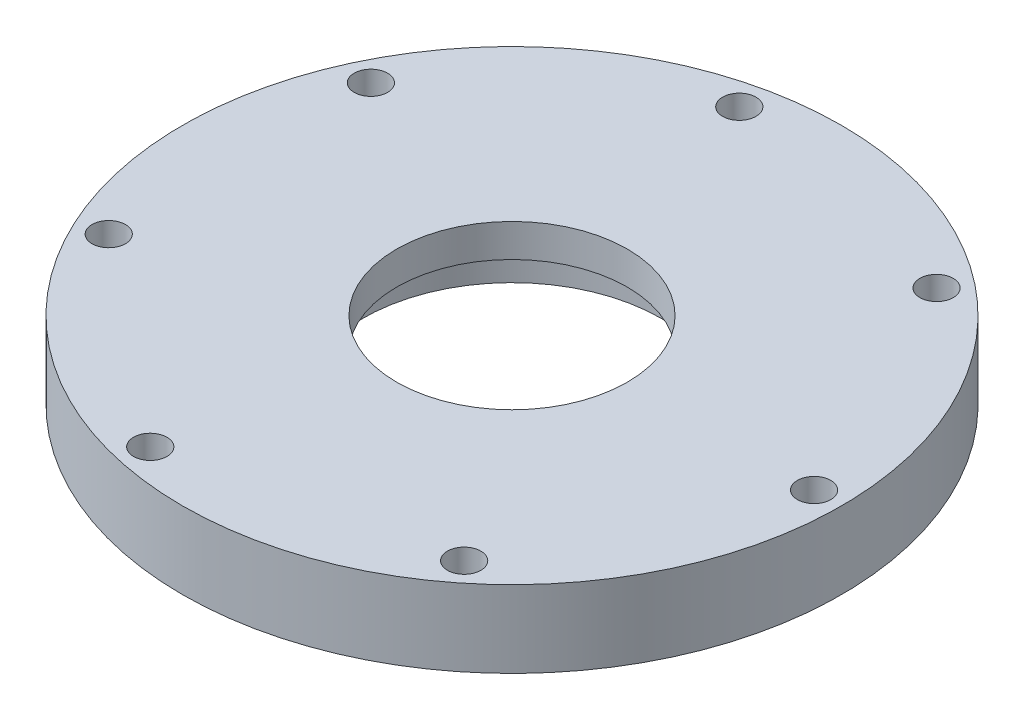
ISO-10303-21;
HEADER;
FILE_DESCRIPTION(('STEP AP214'),'2;1');
FILE_NAME('part.step','',(''),(''),'','','');
FILE_SCHEMA(('AUTOMOTIVE_DESIGN { 1 0 10303 214 1 1 1 1 }'));
ENDSEC;
DATA;
#1=APPLICATION_CONTEXT('core data for automotive mechanical design processes');
#2=APPLICATION_PROTOCOL_DEFINITION('international standard','automotive_design',2000,#1);
#3=PRODUCT_CONTEXT('',#1,'mechanical');
#4=PRODUCT('Part','Part','',(#3));
#5=PRODUCT_RELATED_PRODUCT_CATEGORY('part','',(#4));
#6=PRODUCT_DEFINITION_FORMATION('','',#4);
#7=PRODUCT_DEFINITION_CONTEXT('part definition',#1,'design');
#8=PRODUCT_DEFINITION('design','',#6,#7);
#9=PRODUCT_DEFINITION_SHAPE('','',#8);
#10=(LENGTH_UNIT() NAMED_UNIT(*) SI_UNIT(.MILLI.,.METRE.));
#11=(NAMED_UNIT(*) PLANE_ANGLE_UNIT() SI_UNIT($,.RADIAN.));
#12=(NAMED_UNIT(*) SI_UNIT($,.STERADIAN.) SOLID_ANGLE_UNIT());
#13=UNCERTAINTY_MEASURE_WITH_UNIT(LENGTH_MEASURE(1.E-05),#10,'distance_accuracy_value','');
#14=(GEOMETRIC_REPRESENTATION_CONTEXT(3) GLOBAL_UNCERTAINTY_ASSIGNED_CONTEXT((#13)) GLOBAL_UNIT_ASSIGNED_CONTEXT((#10,
#11,#12)) REPRESENTATION_CONTEXT('',''));
#15=CARTESIAN_POINT('',(0.,0.,0.));
#16=DIRECTION('',(0.,0.,1.));
#17=DIRECTION('',(1.,0.,0.));
#18=AXIS2_PLACEMENT_3D('',#15,#16,#17);
#19=CARTESIAN_POINT('',(0.,7.,0.));
#20=DIRECTION('',(0.,-1.,0.));
#21=DIRECTION('',(0.,0.,-1.));
#22=AXIS2_PLACEMENT_3D('',#19,#20,#21);
#23=CYLINDRICAL_SURFACE('',#22,10.5);
#24=CARTESIAN_POINT('',(0.,7.,0.));
#25=DIRECTION('',(0.,1.,0.));
#26=DIRECTION('',(0.,0.,1.));
#27=AXIS2_PLACEMENT_3D('',#24,#25,#26);
#28=CIRCLE('',#27,10.5);
#29=CARTESIAN_POINT('',(0.,7.,10.5));
#30=VERTEX_POINT('',#29);
#31=EDGE_CURVE('E44',#30,#30,#28,.T.);
#32=ORIENTED_EDGE('',*,*,#31,.T.);
#33=EDGE_LOOP('',(#32));
#34=FACE_BOUND('',#33,.T.);
#35=CARTESIAN_POINT('',(0.,4.,0.));
#36=DIRECTION('',(0.,-1.,0.));
#37=DIRECTION('',(0.,0.,-1.));
#38=AXIS2_PLACEMENT_3D('',#35,#36,#37);
#39=CIRCLE('',#38,10.5);
#40=CARTESIAN_POINT('',(0.,4.,-10.5));
#41=VERTEX_POINT('',#40);
#42=EDGE_CURVE('E35',#41,#41,#39,.T.);
#43=ORIENTED_EDGE('',*,*,#42,.T.);
#44=EDGE_LOOP('',(#43));
#45=FACE_BOUND('',#44,.T.);
#46=ADVANCED_FACE('F31',(#34,#45),#23,.F.);
#47=CARTESIAN_POINT('',(0.,7.,0.));
#48=DIRECTION('',(0.,1.,0.));
#49=DIRECTION('',(0.,0.,1.));
#50=AXIS2_PLACEMENT_3D('',#47,#48,#49);
#51=PLANE('',#50);
#52=CARTESIAN_POINT('',(27.5,7.,0.));
#53=DIRECTION('',(0.,1.,0.));
#54=DIRECTION('',(0.,0.,1.));
#55=AXIS2_PLACEMENT_3D('',#52,#53,#54);
#56=CIRCLE('',#55,1.52);
#57=CARTESIAN_POINT('',(27.5,7.,1.52));
#58=VERTEX_POINT('',#57);
#59=EDGE_CURVE('E91',#58,#58,#56,.T.);
#60=ORIENTED_EDGE('',*,*,#59,.F.);
#61=EDGE_LOOP('',(#60));
#62=FACE_BOUND('',#61,.T.);
#63=CARTESIAN_POINT('',(17.1459695511151,7.,21.5003657678709));
#64=DIRECTION('',(0.,1.,0.));
#65=DIRECTION('',(0.,0.,1.));
#66=AXIS2_PLACEMENT_3D('',#63,#64,#65);
#67=CIRCLE('',#66,1.52);
#68=CARTESIAN_POINT('',(17.1459695511151,7.,23.0203657678709));
#69=VERTEX_POINT('',#68);
#70=EDGE_CURVE('E85',#69,#69,#67,.T.);
#71=ORIENTED_EDGE('',*,*,#70,.F.);
#72=EDGE_LOOP('',(#71));
#73=FACE_BOUND('',#72,.T.);
#74=CARTESIAN_POINT('',(-6.11932568379875,7.,26.8105175850001));
#75=DIRECTION('',(0.,1.,0.));
#76=DIRECTION('',(0.,0.,1.));
#77=AXIS2_PLACEMENT_3D('',#74,#75,#76);
#78=CIRCLE('',#77,1.52);
#79=CARTESIAN_POINT('',(-6.11932568379875,7.,28.3305175850001));
#80=VERTEX_POINT('',#79);
#81=EDGE_CURVE('E79',#80,#80,#78,.T.);
#82=ORIENTED_EDGE('',*,*,#81,.F.);
#83=EDGE_LOOP('',(#82));
#84=FACE_BOUND('',#83,.T.);
#85=CARTESIAN_POINT('',(-24.7766438673166,7.,11.9318028257327));
#86=DIRECTION('',(0.,1.,0.));
#87=DIRECTION('',(0.,0.,1.));
#88=AXIS2_PLACEMENT_3D('',#85,#86,#87);
#89=CIRCLE('',#88,1.52);
#90=CARTESIAN_POINT('',(-24.7766438673166,7.,13.4518028257327));
#91=VERTEX_POINT('',#90);
#92=EDGE_CURVE('E73',#91,#91,#89,.T.);
#93=ORIENTED_EDGE('',*,*,#92,.F.);
#94=EDGE_LOOP('',(#93));
#95=FACE_BOUND('',#94,.T.);
#96=CARTESIAN_POINT('',(-24.7766438673164,7.,-11.931802825733));
#97=DIRECTION('',(0.,1.,0.));
#98=DIRECTION('',(0.,0.,1.));
#99=AXIS2_PLACEMENT_3D('',#96,#97,#98);
#100=CIRCLE('',#99,1.52);
#101=CARTESIAN_POINT('',(-24.7766438673164,7.,-10.411802825733));
#102=VERTEX_POINT('',#101);
#103=EDGE_CURVE('E67',#102,#102,#100,.T.);
#104=ORIENTED_EDGE('',*,*,#103,.F.);
#105=EDGE_LOOP('',(#104));
#106=FACE_BOUND('',#105,.T.);
#107=CARTESIAN_POINT('',(-6.11932568379838,7.,-26.8105175850002));
#108=DIRECTION('',(0.,1.,0.));
#109=DIRECTION('',(0.,0.,1.));
#110=AXIS2_PLACEMENT_3D('',#107,#108,#109);
#111=CIRCLE('',#110,1.52);
#112=CARTESIAN_POINT('',(-6.11932568379838,7.,-25.2905175850002));
#113=VERTEX_POINT('',#112);
#114=EDGE_CURVE('E61',#113,#113,#111,.T.);
#115=ORIENTED_EDGE('',*,*,#114,.F.);
#116=EDGE_LOOP('',(#115));
#117=FACE_BOUND('',#116,.T.);
#118=CARTESIAN_POINT('',(17.1459695511154,7.,-21.5003657678706));
#119=DIRECTION('',(0.,1.,0.));
#120=DIRECTION('',(0.,0.,1.));
#121=AXIS2_PLACEMENT_3D('',#118,#119,#120);
#122=CIRCLE('',#121,1.52);
#123=CARTESIAN_POINT('',(17.1459695511154,7.,-19.9803657678706));
#124=VERTEX_POINT('',#123);
#125=EDGE_CURVE('E55',#124,#124,#122,.T.);
#126=ORIENTED_EDGE('',*,*,#125,.F.);
#127=EDGE_LOOP('',(#126));
#128=FACE_BOUND('',#127,.T.);
#129=CARTESIAN_POINT('',(0.,7.,0.));
#130=DIRECTION('',(0.,1.,0.));
#131=DIRECTION('',(0.,0.,1.));
#132=AXIS2_PLACEMENT_3D('',#129,#130,#131);
#133=CIRCLE('',#132,30.);
#134=CARTESIAN_POINT('',(0.,7.,30.));
#135=VERTEX_POINT('',#134);
#136=EDGE_CURVE('E10',#135,#135,#133,.T.);
#137=ORIENTED_EDGE('',*,*,#136,.T.);
#138=EDGE_LOOP('',(#137));
#139=FACE_BOUND('',#138,.T.);
#140=ORIENTED_EDGE('',*,*,#31,.F.);
#141=EDGE_LOOP('',(#140));
#142=FACE_BOUND('',#141,.T.);
#143=ADVANCED_FACE('F107',(#62,#73,#84,#95,#106,#117,#128,#139,#142),#51,.T.);
#144=CARTESIAN_POINT('',(0.,0.,0.));
#145=DIRECTION('',(0.,1.,0.));
#146=DIRECTION('',(0.,0.,1.));
#147=AXIS2_PLACEMENT_3D('',#144,#145,#146);
#148=PLANE('',#147);
#149=CARTESIAN_POINT('',(27.5,0.,0.));
#150=DIRECTION('',(0.,1.,0.));
#151=DIRECTION('',(0.,0.,1.));
#152=AXIS2_PLACEMENT_3D('',#149,#150,#151);
#153=CIRCLE('',#152,1.52);
#154=CARTESIAN_POINT('',(27.5,0.,1.52));
#155=VERTEX_POINT('',#154);
#156=EDGE_CURVE('E52',#155,#155,#153,.T.);
#157=ORIENTED_EDGE('',*,*,#156,.T.);
#158=EDGE_LOOP('',(#157));
#159=FACE_BOUND('',#158,.T.);
#160=CARTESIAN_POINT('',(17.1459695511151,0.,21.5003657678709));
#161=DIRECTION('',(0.,1.,0.));
#162=DIRECTION('',(0.,0.,1.));
#163=AXIS2_PLACEMENT_3D('',#160,#161,#162);
#164=CIRCLE('',#163,1.52);
#165=CARTESIAN_POINT('',(17.1459695511151,0.,23.0203657678709));
#166=VERTEX_POINT('',#165);
#167=EDGE_CURVE('E88',#166,#166,#164,.T.);
#168=ORIENTED_EDGE('',*,*,#167,.T.);
#169=EDGE_LOOP('',(#168));
#170=FACE_BOUND('',#169,.T.);
#171=CARTESIAN_POINT('',(-6.11932568379875,0.,26.8105175850001));
#172=DIRECTION('',(0.,1.,0.));
#173=DIRECTION('',(0.,0.,1.));
#174=AXIS2_PLACEMENT_3D('',#171,#172,#173);
#175=CIRCLE('',#174,1.52);
#176=CARTESIAN_POINT('',(-6.11932568379875,0.,28.3305175850001));
#177=VERTEX_POINT('',#176);
#178=EDGE_CURVE('E82',#177,#177,#175,.T.);
#179=ORIENTED_EDGE('',*,*,#178,.T.);
#180=EDGE_LOOP('',(#179));
#181=FACE_BOUND('',#180,.T.);
#182=CARTESIAN_POINT('',(-24.7766438673166,0.,11.9318028257327));
#183=DIRECTION('',(0.,1.,0.));
#184=DIRECTION('',(0.,0.,1.));
#185=AXIS2_PLACEMENT_3D('',#182,#183,#184);
#186=CIRCLE('',#185,1.52);
#187=CARTESIAN_POINT('',(-24.7766438673166,0.,13.4518028257327));
#188=VERTEX_POINT('',#187);
#189=EDGE_CURVE('E76',#188,#188,#186,.T.);
#190=ORIENTED_EDGE('',*,*,#189,.T.);
#191=EDGE_LOOP('',(#190));
#192=FACE_BOUND('',#191,.T.);
#193=CARTESIAN_POINT('',(-24.7766438673164,0.,-11.931802825733));
#194=DIRECTION('',(0.,1.,0.));
#195=DIRECTION('',(0.,0.,1.));
#196=AXIS2_PLACEMENT_3D('',#193,#194,#195);
#197=CIRCLE('',#196,1.52);
#198=CARTESIAN_POINT('',(-24.7766438673164,0.,-10.411802825733));
#199=VERTEX_POINT('',#198);
#200=EDGE_CURVE('E70',#199,#199,#197,.T.);
#201=ORIENTED_EDGE('',*,*,#200,.T.);
#202=EDGE_LOOP('',(#201));
#203=FACE_BOUND('',#202,.T.);
#204=CARTESIAN_POINT('',(-6.11932568379838,0.,-26.8105175850002));
#205=DIRECTION('',(0.,1.,0.));
#206=DIRECTION('',(0.,0.,1.));
#207=AXIS2_PLACEMENT_3D('',#204,#205,#206);
#208=CIRCLE('',#207,1.52);
#209=CARTESIAN_POINT('',(-6.11932568379838,0.,-25.2905175850002));
#210=VERTEX_POINT('',#209);
#211=EDGE_CURVE('E64',#210,#210,#208,.T.);
#212=ORIENTED_EDGE('',*,*,#211,.T.);
#213=EDGE_LOOP('',(#212));
#214=FACE_BOUND('',#213,.T.);
#215=CARTESIAN_POINT('',(17.1459695511154,0.,-21.5003657678706));
#216=DIRECTION('',(0.,1.,0.));
#217=DIRECTION('',(0.,0.,1.));
#218=AXIS2_PLACEMENT_3D('',#215,#216,#217);
#219=CIRCLE('',#218,1.52);
#220=CARTESIAN_POINT('',(17.1459695511154,0.,-19.9803657678706));
#221=VERTEX_POINT('',#220);
#222=EDGE_CURVE('E58',#221,#221,#219,.T.);
#223=ORIENTED_EDGE('',*,*,#222,.T.);
#224=EDGE_LOOP('',(#223));
#225=FACE_BOUND('',#224,.T.);
#226=CARTESIAN_POINT('',(0.,0.,0.));
#227=DIRECTION('',(0.,-1.,0.));
#228=DIRECTION('',(0.,0.,-1.));
#229=AXIS2_PLACEMENT_3D('',#226,#227,#228);
#230=CIRCLE('',#229,13.575);
#231=CARTESIAN_POINT('',(0.,0.,-13.575));
#232=VERTEX_POINT('',#231);
#233=EDGE_CURVE('E48',#232,#232,#230,.T.);
#234=ORIENTED_EDGE('',*,*,#233,.F.);
#235=EDGE_LOOP('',(#234));
#236=FACE_BOUND('',#235,.T.);
#237=CARTESIAN_POINT('',(0.,0.,0.));
#238=DIRECTION('',(0.,1.,0.));
#239=DIRECTION('',(0.,0.,1.));
#240=AXIS2_PLACEMENT_3D('',#237,#238,#239);
#241=CIRCLE('',#240,30.);
#242=CARTESIAN_POINT('',(0.,0.,30.));
#243=VERTEX_POINT('',#242);
#244=EDGE_CURVE('E39',#243,#243,#241,.T.);
#245=ORIENTED_EDGE('',*,*,#244,.F.);
#246=EDGE_LOOP('',(#245));
#247=FACE_BOUND('',#246,.T.);
#248=ADVANCED_FACE('F97',(#159,#170,#181,#192,#203,#214,#225,#236,#247),#148,.F.);
#249=CARTESIAN_POINT('',(0.,7.,0.));
#250=DIRECTION('',(0.,-1.,0.));
#251=DIRECTION('',(0.,0.,-1.));
#252=AXIS2_PLACEMENT_3D('',#249,#250,#251);
#253=CYLINDRICAL_SURFACE('',#252,30.);
#254=ORIENTED_EDGE('',*,*,#136,.F.);
#255=EDGE_LOOP('',(#254));
#256=FACE_BOUND('',#255,.T.);
#257=ORIENTED_EDGE('',*,*,#244,.T.);
#258=EDGE_LOOP('',(#257));
#259=FACE_BOUND('',#258,.T.);
#260=ADVANCED_FACE('F33',(#256,#259),#253,.T.);
#261=CARTESIAN_POINT('',(0.,4.,0.));
#262=DIRECTION('',(0.,-1.,0.));
#263=DIRECTION('',(0.,0.,-1.));
#264=AXIS2_PLACEMENT_3D('',#261,#262,#263);
#265=CYLINDRICAL_SURFACE('',#264,13.575);
#266=CARTESIAN_POINT('',(0.,4.,0.));
#267=DIRECTION('',(0.,-1.,0.));
#268=DIRECTION('',(0.,0.,-1.));
#269=AXIS2_PLACEMENT_3D('',#266,#267,#268);
#270=CIRCLE('',#269,13.575);
#271=CARTESIAN_POINT('',(0.,4.,-13.575));
#272=VERTEX_POINT('',#271);
#273=EDGE_CURVE('E51',#272,#272,#270,.T.);
#274=ORIENTED_EDGE('',*,*,#273,.F.);
#275=EDGE_LOOP('',(#274));
#276=FACE_BOUND('',#275,.T.);
#277=ORIENTED_EDGE('',*,*,#233,.T.);
#278=EDGE_LOOP('',(#277));
#279=FACE_BOUND('',#278,.T.);
#280=ADVANCED_FACE('F135',(#276,#279),#265,.F.);
#281=CARTESIAN_POINT('',(0.,4.,0.));
#282=DIRECTION('',(0.,-1.,0.));
#283=DIRECTION('',(0.,0.,-1.));
#284=AXIS2_PLACEMENT_3D('',#281,#282,#283);
#285=PLANE('',#284);
#286=ORIENTED_EDGE('',*,*,#42,.F.);
#287=EDGE_LOOP('',(#286));
#288=FACE_BOUND('',#287,.T.);
#289=ORIENTED_EDGE('',*,*,#273,.T.);
#290=EDGE_LOOP('',(#289));
#291=FACE_BOUND('',#290,.T.);
#292=ADVANCED_FACE('F131',(#288,#291),#285,.T.);
#293=CARTESIAN_POINT('',(17.1459695511154,0.,-21.5003657678706));
#294=DIRECTION('',(0.,1.,0.));
#295=DIRECTION('',(0.,0.,1.));
#296=AXIS2_PLACEMENT_3D('',#293,#294,#295);
#297=CYLINDRICAL_SURFACE('',#296,1.52);
#298=ORIENTED_EDGE('',*,*,#222,.F.);
#299=EDGE_LOOP('',(#298));
#300=FACE_BOUND('',#299,.T.);
#301=ORIENTED_EDGE('',*,*,#125,.T.);
#302=EDGE_LOOP('',(#301));
#303=FACE_BOUND('',#302,.T.);
#304=ADVANCED_FACE('F134',(#300,#303),#297,.F.);
#305=CARTESIAN_POINT('',(-6.11932568379838,0.,-26.8105175850002));
#306=DIRECTION('',(0.,1.,0.));
#307=DIRECTION('',(0.,0.,1.));
#308=AXIS2_PLACEMENT_3D('',#305,#306,#307);
#309=CYLINDRICAL_SURFACE('',#308,1.52);
#310=ORIENTED_EDGE('',*,*,#211,.F.);
#311=EDGE_LOOP('',(#310));
#312=FACE_BOUND('',#311,.T.);
#313=ORIENTED_EDGE('',*,*,#114,.T.);
#314=EDGE_LOOP('',(#313));
#315=FACE_BOUND('',#314,.T.);
#316=ADVANCED_FACE('F170',(#312,#315),#309,.F.);
#317=CARTESIAN_POINT('',(-24.7766438673164,0.,-11.931802825733));
#318=DIRECTION('',(0.,1.,0.));
#319=DIRECTION('',(0.,0.,1.));
#320=AXIS2_PLACEMENT_3D('',#317,#318,#319);
#321=CYLINDRICAL_SURFACE('',#320,1.52);
#322=ORIENTED_EDGE('',*,*,#200,.F.);
#323=EDGE_LOOP('',(#322));
#324=FACE_BOUND('',#323,.T.);
#325=ORIENTED_EDGE('',*,*,#103,.T.);
#326=EDGE_LOOP('',(#325));
#327=FACE_BOUND('',#326,.T.);
#328=ADVANCED_FACE('F178',(#324,#327),#321,.F.);
#329=CARTESIAN_POINT('',(-24.7766438673166,0.,11.9318028257327));
#330=DIRECTION('',(0.,1.,0.));
#331=DIRECTION('',(0.,0.,1.));
#332=AXIS2_PLACEMENT_3D('',#329,#330,#331);
#333=CYLINDRICAL_SURFACE('',#332,1.52);
#334=ORIENTED_EDGE('',*,*,#189,.F.);
#335=EDGE_LOOP('',(#334));
#336=FACE_BOUND('',#335,.T.);
#337=ORIENTED_EDGE('',*,*,#92,.T.);
#338=EDGE_LOOP('',(#337));
#339=FACE_BOUND('',#338,.T.);
#340=ADVANCED_FACE('F186',(#336,#339),#333,.F.);
#341=CARTESIAN_POINT('',(-6.11932568379875,0.,26.8105175850001));
#342=DIRECTION('',(0.,1.,0.));
#343=DIRECTION('',(0.,0.,1.));
#344=AXIS2_PLACEMENT_3D('',#341,#342,#343);
#345=CYLINDRICAL_SURFACE('',#344,1.52);
#346=ORIENTED_EDGE('',*,*,#178,.F.);
#347=EDGE_LOOP('',(#346));
#348=FACE_BOUND('',#347,.T.);
#349=ORIENTED_EDGE('',*,*,#81,.T.);
#350=EDGE_LOOP('',(#349));
#351=FACE_BOUND('',#350,.T.);
#352=ADVANCED_FACE('F194',(#348,#351),#345,.F.);
#353=CARTESIAN_POINT('',(17.1459695511151,0.,21.5003657678709));
#354=DIRECTION('',(0.,1.,0.));
#355=DIRECTION('',(0.,0.,1.));
#356=AXIS2_PLACEMENT_3D('',#353,#354,#355);
#357=CYLINDRICAL_SURFACE('',#356,1.52);
#358=ORIENTED_EDGE('',*,*,#167,.F.);
#359=EDGE_LOOP('',(#358));
#360=FACE_BOUND('',#359,.T.);
#361=ORIENTED_EDGE('',*,*,#70,.T.);
#362=EDGE_LOOP('',(#361));
#363=FACE_BOUND('',#362,.T.);
#364=ADVANCED_FACE('F103',(#360,#363),#357,.F.);
#365=CARTESIAN_POINT('',(27.5,0.,0.));
#366=DIRECTION('',(0.,1.,0.));
#367=DIRECTION('',(0.,0.,1.));
#368=AXIS2_PLACEMENT_3D('',#365,#366,#367);
#369=CYLINDRICAL_SURFACE('',#368,1.52);
#370=ORIENTED_EDGE('',*,*,#156,.F.);
#371=EDGE_LOOP('',(#370));
#372=FACE_BOUND('',#371,.T.);
#373=ORIENTED_EDGE('',*,*,#59,.T.);
#374=EDGE_LOOP('',(#373));
#375=FACE_BOUND('',#374,.T.);
#376=ADVANCED_FACE('F100',(#372,#375),#369,.F.);
#377=CLOSED_SHELL('',(#46,#143,#248,#260,#280,#292,#304,#316,#328,#340,#352,#364,#376));
#378=MANIFOLD_SOLID_BREP('B2',#377);
#379=ADVANCED_BREP_SHAPE_REPRESENTATION('',(#18,#378),#14);
#380=SHAPE_DEFINITION_REPRESENTATION(#9,#379);
ENDSEC;
END-ISO-10303-21;
